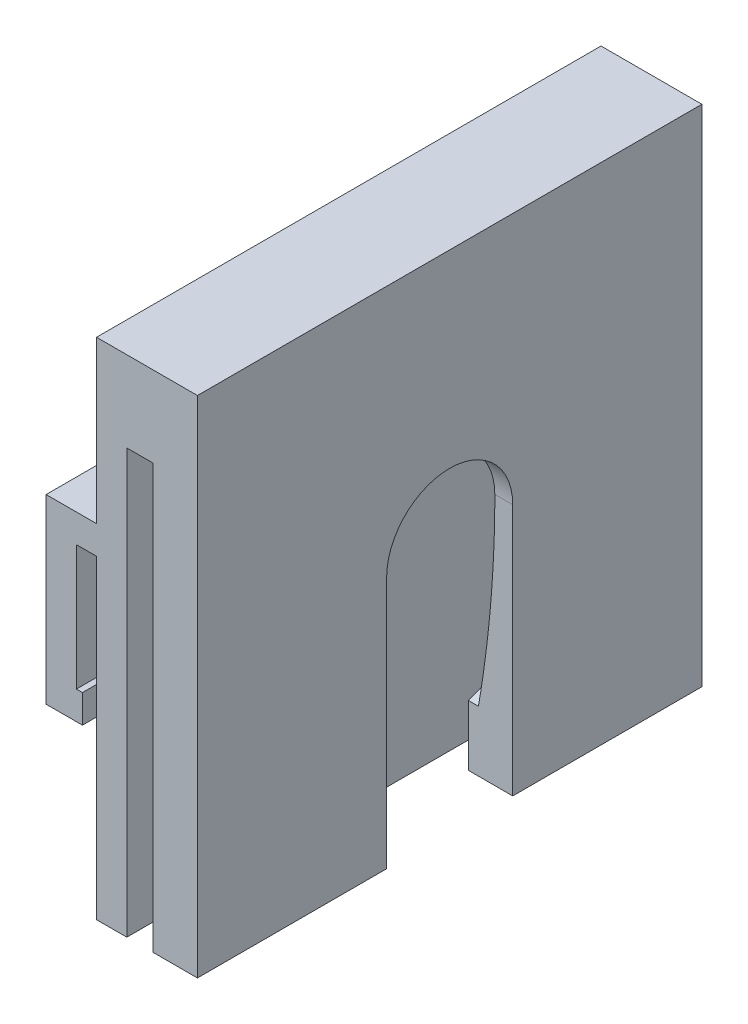
ISO-10303-21;
HEADER;
FILE_DESCRIPTION(('STEP AP214'),'2;1');
FILE_NAME('part.step','',(''),(''),'','','');
FILE_SCHEMA(('AUTOMOTIVE_DESIGN { 1 0 10303 214 1 1 1 1 }'));
ENDSEC;
DATA;
#1=APPLICATION_CONTEXT('core data for automotive mechanical design processes');
#2=APPLICATION_PROTOCOL_DEFINITION('international standard','automotive_design',2000,#1);
#3=PRODUCT_CONTEXT('',#1,'mechanical');
#4=PRODUCT('Part','Part','',(#3));
#5=PRODUCT_RELATED_PRODUCT_CATEGORY('part','',(#4));
#6=PRODUCT_DEFINITION_FORMATION('','',#4);
#7=PRODUCT_DEFINITION_CONTEXT('part definition',#1,'design');
#8=PRODUCT_DEFINITION('design','',#6,#7);
#9=PRODUCT_DEFINITION_SHAPE('','',#8);
#10=(LENGTH_UNIT() NAMED_UNIT(*) SI_UNIT(.MILLI.,.METRE.));
#11=(NAMED_UNIT(*) PLANE_ANGLE_UNIT() SI_UNIT($,.RADIAN.));
#12=(NAMED_UNIT(*) SI_UNIT($,.STERADIAN.) SOLID_ANGLE_UNIT());
#13=UNCERTAINTY_MEASURE_WITH_UNIT(LENGTH_MEASURE(1.E-05),#10,'distance_accuracy_value','');
#14=(GEOMETRIC_REPRESENTATION_CONTEXT(3) GLOBAL_UNCERTAINTY_ASSIGNED_CONTEXT((#13)) GLOBAL_UNIT_ASSIGNED_CONTEXT((#10,
#11,#12)) REPRESENTATION_CONTEXT('',''));
#15=CARTESIAN_POINT('',(0.,0.,0.));
#16=DIRECTION('',(0.,0.,1.));
#17=DIRECTION('',(1.,0.,0.));
#18=AXIS2_PLACEMENT_3D('',#15,#16,#17);
#19=CARTESIAN_POINT('',(-34.8553390593274,-12.5,25.));
#20=DIRECTION('',(0.,-1.,0.));
#21=DIRECTION('',(0.,0.,-1.));
#22=AXIS2_PLACEMENT_3D('',#19,#20,#21);
#23=PLANE('',#22);
#24=DIRECTION('',(1.,0.,0.));
#25=VECTOR('',#24,1.);
#26=CARTESIAN_POINT('',(-15.9642353760524,-12.5,9.375));
#27=LINE('',#26,#25);
#28=CARTESIAN_POINT('',(3.3,-12.5,9.375));
#29=VERTEX_POINT('',#28);
#30=CARTESIAN_POINT('',(5.5,-12.5,9.375));
#31=VERTEX_POINT('',#30);
#32=EDGE_CURVE('E274',#29,#31,#27,.T.);
#33=ORIENTED_EDGE('',*,*,#32,.F.);
#34=DIRECTION('',(0.,0.,1.));
#35=VECTOR('',#34,1.);
#36=CARTESIAN_POINT('',(3.3,-12.5,0.));
#37=LINE('',#36,#35);
#38=CARTESIAN_POINT('',(3.3,-12.5,0.));
#39=VERTEX_POINT('',#38);
#40=EDGE_CURVE('E236',#39,#29,#37,.T.);
#41=ORIENTED_EDGE('',*,*,#40,.F.);
#42=DIRECTION('',(1.,0.,0.));
#43=VECTOR('',#42,1.);
#44=CARTESIAN_POINT('',(-34.8553390593274,-12.5,0.));
#45=LINE('',#44,#43);
#46=CARTESIAN_POINT('',(5.5,-12.5,0.));
#47=VERTEX_POINT('',#46);
#48=EDGE_CURVE('E333',#39,#47,#45,.T.);
#49=ORIENTED_EDGE('',*,*,#48,.T.);
#50=DIRECTION('',(0.,0.,-1.));
#51=VECTOR('',#50,1.);
#52=CARTESIAN_POINT('',(5.5,-12.5,25.));
#53=LINE('',#52,#51);
#54=EDGE_CURVE('E304',#31,#47,#53,.T.);
#55=ORIENTED_EDGE('',*,*,#54,.F.);
#56=EDGE_LOOP('',(#33,#41,#49,#55));
#57=FACE_BOUND('',#56,.T.);
#58=ADVANCED_FACE('F33',(#57),#23,.T.);
#59=DIRECTION('',(0.,0.,-1.));
#60=VECTOR('',#59,1.);
#61=CARTESIAN_POINT('',(1.99999999999999,-12.5,25.));
#62=LINE('',#61,#60);
#63=CARTESIAN_POINT('',(1.99999999999999,-12.5,25.));
#64=VERTEX_POINT('',#63);
#65=CARTESIAN_POINT('',(2.,-12.5,0.));
#66=VERTEX_POINT('',#65);
#67=EDGE_CURVE('E273',#64,#66,#62,.T.);
#68=ORIENTED_EDGE('',*,*,#67,.F.);
#69=DIRECTION('',(1.,0.,0.));
#70=VECTOR('',#69,1.);
#71=CARTESIAN_POINT('',(-34.8553390593274,-12.5,25.));
#72=LINE('',#71,#70);
#73=CARTESIAN_POINT('',(0.5,-12.5,25.));
#74=VERTEX_POINT('',#73);
#75=EDGE_CURVE('E334',#74,#64,#72,.T.);
#76=ORIENTED_EDGE('',*,*,#75,.F.);
#77=DIRECTION('',(0.,0.,1.));
#78=VECTOR('',#77,1.);
#79=CARTESIAN_POINT('',(0.5,-12.5,25.));
#80=LINE('',#79,#78);
#81=CARTESIAN_POINT('',(0.5,-12.5,0.));
#82=VERTEX_POINT('',#81);
#83=EDGE_CURVE('E326',#82,#74,#80,.T.);
#84=ORIENTED_EDGE('',*,*,#83,.F.);
#85=EDGE_CURVE('E330',#82,#66,#45,.T.);
#86=ORIENTED_EDGE('',*,*,#85,.T.);
#87=EDGE_LOOP('',(#68,#76,#84,#86));
#88=FACE_BOUND('',#87,.T.);
#89=ADVANCED_FACE('F443',(#88),#23,.T.);
#90=CARTESIAN_POINT('',(2.,-4.5,25.));
#91=DIRECTION('',(0.,1.,0.));
#92=DIRECTION('',(-1.,0.,0.));
#93=AXIS2_PLACEMENT_3D('',#90,#91,#92);
#94=PLANE('',#93);
#95=DIRECTION('',(1.,0.,0.));
#96=VECTOR('',#95,1.);
#97=CARTESIAN_POINT('',(2.,-4.5,0.));
#98=LINE('',#97,#96);
#99=CARTESIAN_POINT('',(-2.,-4.5,0.));
#100=VERTEX_POINT('',#99);
#101=CARTESIAN_POINT('',(-0.200000000000001,-4.5,0.));
#102=VERTEX_POINT('',#101);
#103=EDGE_CURVE('E358',#100,#102,#98,.T.);
#104=ORIENTED_EDGE('',*,*,#103,.T.);
#105=DIRECTION('',(0.,0.,-1.));
#106=VECTOR('',#105,1.);
#107=CARTESIAN_POINT('',(-0.200000000000001,-4.5,25.));
#108=LINE('',#107,#106);
#109=CARTESIAN_POINT('',(-0.200000000000001,-4.5,25.));
#110=VERTEX_POINT('',#109);
#111=EDGE_CURVE('E229',#110,#102,#108,.T.);
#112=ORIENTED_EDGE('',*,*,#111,.F.);
#113=DIRECTION('',(1.,0.,0.));
#114=VECTOR('',#113,1.);
#115=CARTESIAN_POINT('',(2.,-4.5,25.));
#116=LINE('',#115,#114);
#117=CARTESIAN_POINT('',(-2.,-4.5,25.));
#118=VERTEX_POINT('',#117);
#119=EDGE_CURVE('E350',#118,#110,#116,.T.);
#120=ORIENTED_EDGE('',*,*,#119,.F.);
#121=DIRECTION('',(0.,0.,-1.));
#122=VECTOR('',#121,1.);
#123=CARTESIAN_POINT('',(-2.,-4.5,25.));
#124=LINE('',#123,#122);
#125=EDGE_CURVE('E364',#118,#100,#124,.T.);
#126=ORIENTED_EDGE('',*,*,#125,.T.);
#127=EDGE_LOOP('',(#104,#112,#120,#126));
#128=FACE_BOUND('',#127,.T.);
#129=ADVANCED_FACE('F448',(#128),#94,.F.);
#130=CARTESIAN_POINT('',(2.,4.5,25.));
#131=DIRECTION('',(0.,-1.,0.));
#132=DIRECTION('',(1.,0.,0.));
#133=AXIS2_PLACEMENT_3D('',#130,#131,#132);
#134=PLANE('',#133);
#135=DIRECTION('',(0.,0.,1.));
#136=VECTOR('',#135,1.);
#137=CARTESIAN_POINT('',(0.500000000000001,4.5,25.));
#138=LINE('',#137,#136);
#139=CARTESIAN_POINT('',(0.5,4.5,0.));
#140=VERTEX_POINT('',#139);
#141=CARTESIAN_POINT('',(0.499999999999999,4.5,25.));
#142=VERTEX_POINT('',#141);
#143=EDGE_CURVE('E339',#140,#142,#138,.T.);
#144=ORIENTED_EDGE('',*,*,#143,.F.);
#145=DIRECTION('',(-1.,0.,0.));
#146=VECTOR('',#145,1.);
#147=CARTESIAN_POINT('',(2.,4.5,0.));
#148=LINE('',#147,#146);
#149=CARTESIAN_POINT('',(-2.,4.5,0.));
#150=VERTEX_POINT('',#149);
#151=EDGE_CURVE('E351',#140,#150,#148,.T.);
#152=ORIENTED_EDGE('',*,*,#151,.T.);
#153=DIRECTION('',(0.,0.,-1.));
#154=VECTOR('',#153,1.);
#155=CARTESIAN_POINT('',(-2.,4.5,25.));
#156=LINE('',#155,#154);
#157=CARTESIAN_POINT('',(-2.,4.5,25.));
#158=VERTEX_POINT('',#157);
#159=EDGE_CURVE('E355',#158,#150,#156,.T.);
#160=ORIENTED_EDGE('',*,*,#159,.F.);
#161=DIRECTION('',(-1.,0.,0.));
#162=VECTOR('',#161,1.);
#163=CARTESIAN_POINT('',(2.,4.5,25.));
#164=LINE('',#163,#162);
#165=EDGE_CURVE('E353',#142,#158,#164,.T.);
#166=ORIENTED_EDGE('',*,*,#165,.F.);
#167=EDGE_LOOP('',(#144,#152,#160,#166));
#168=FACE_BOUND('',#167,.T.);
#169=ADVANCED_FACE('F494',(#168),#134,.F.);
#170=CARTESIAN_POINT('',(-2.,4.5,25.));
#171=DIRECTION('',(1.,0.,0.));
#172=DIRECTION('',(0.,1.,0.));
#173=AXIS2_PLACEMENT_3D('',#170,#171,#172);
#174=PLANE('',#173);
#175=DIRECTION('',(0.,-1.,0.));
#176=VECTOR('',#175,1.);
#177=CARTESIAN_POINT('',(-2.,4.5,0.));
#178=LINE('',#177,#176);
#179=EDGE_CURVE('E203',#150,#100,#178,.T.);
#180=ORIENTED_EDGE('',*,*,#179,.T.);
#181=ORIENTED_EDGE('',*,*,#125,.F.);
#182=DIRECTION('',(0.,-1.,0.));
#183=VECTOR('',#182,1.);
#184=CARTESIAN_POINT('',(-2.,4.5,25.));
#185=LINE('',#184,#183);
#186=EDGE_CURVE('E347',#158,#118,#185,.T.);
#187=ORIENTED_EDGE('',*,*,#186,.F.);
#188=ORIENTED_EDGE('',*,*,#159,.T.);
#189=EDGE_LOOP('',(#180,#181,#187,#188));
#190=FACE_BOUND('',#189,.T.);
#191=ADVANCED_FACE('F35',(#190),#174,.F.);
#192=CARTESIAN_POINT('',(0.,0.,25.));
#193=DIRECTION('',(0.,0.,-1.));
#194=DIRECTION('',(-1.,0.,0.));
#195=AXIS2_PLACEMENT_3D('',#192,#193,#194);
#196=PLANE('',#195);
#197=DIRECTION('',(1.,0.,0.));
#198=VECTOR('',#197,1.);
#199=CARTESIAN_POINT('',(0.5,3.1,25.));
#200=LINE('',#199,#198);
#201=CARTESIAN_POINT('',(-0.500000000000001,3.1,25.));
#202=VERTEX_POINT('',#201);
#203=CARTESIAN_POINT('',(0.5,3.1,25.));
#204=VERTEX_POINT('',#203);
#205=EDGE_CURVE('E210',#202,#204,#200,.T.);
#206=ORIENTED_EDGE('',*,*,#205,.T.);
#207=DIRECTION('',(0.,-1.,0.));
#208=VECTOR('',#207,1.);
#209=CARTESIAN_POINT('',(0.5,3.,25.));
#210=LINE('',#209,#208);
#211=EDGE_CURVE('E204',#204,#74,#210,.T.);
#212=ORIENTED_EDGE('',*,*,#211,.T.);
#213=ORIENTED_EDGE('',*,*,#75,.T.);
#214=DIRECTION('',(0.,-1.,0.));
#215=VECTOR('',#214,1.);
#216=CARTESIAN_POINT('',(1.99999999999999,8.5,25.));
#217=LINE('',#216,#215);
#218=CARTESIAN_POINT('',(1.99999999999999,8.5,25.));
#219=VERTEX_POINT('',#218);
#220=EDGE_CURVE('E291',#219,#64,#217,.T.);
#221=ORIENTED_EDGE('',*,*,#220,.F.);
#222=DIRECTION('',(-1.,0.,0.));
#223=VECTOR('',#222,1.);
#224=CARTESIAN_POINT('',(1.99999999999999,8.5,25.));
#225=LINE('',#224,#223);
#226=CARTESIAN_POINT('',(3.3,8.5,25.));
#227=VERTEX_POINT('',#226);
#228=EDGE_CURVE('E287',#227,#219,#225,.T.);
#229=ORIENTED_EDGE('',*,*,#228,.F.);
#230=DIRECTION('',(0.,1.,0.));
#231=VECTOR('',#230,1.);
#232=CARTESIAN_POINT('',(3.3,-12.5,25.));
#233=LINE('',#232,#231);
#234=CARTESIAN_POINT('',(3.3,-12.5,25.));
#235=VERTEX_POINT('',#234);
#236=EDGE_CURVE('E256',#235,#227,#233,.T.);
#237=ORIENTED_EDGE('',*,*,#236,.F.);
#238=CARTESIAN_POINT('',(5.5,-12.5,25.));
#239=VERTEX_POINT('',#238);
#240=EDGE_CURVE('E317',#235,#239,#72,.T.);
#241=ORIENTED_EDGE('',*,*,#240,.T.);
#242=DIRECTION('',(0.,-1.,0.));
#243=VECTOR('',#242,1.);
#244=CARTESIAN_POINT('',(5.5,12.5,25.));
#245=LINE('',#244,#243);
#246=CARTESIAN_POINT('',(5.5,12.5,25.));
#247=VERTEX_POINT('',#246);
#248=EDGE_CURVE('E314',#247,#239,#245,.T.);
#249=ORIENTED_EDGE('',*,*,#248,.F.);
#250=DIRECTION('',(1.,0.,0.));
#251=VECTOR('',#250,1.);
#252=CARTESIAN_POINT('',(-34.8553390593274,12.5,25.));
#253=LINE('',#252,#251);
#254=CARTESIAN_POINT('',(0.5,12.5,25.));
#255=VERTEX_POINT('',#254);
#256=EDGE_CURVE('E322',#255,#247,#253,.T.);
#257=ORIENTED_EDGE('',*,*,#256,.F.);
#258=DIRECTION('',(0.,1.,0.));
#259=VECTOR('',#258,1.);
#260=CARTESIAN_POINT('',(0.5,12.5,25.));
#261=LINE('',#260,#259);
#262=EDGE_CURVE('E324',#142,#255,#261,.T.);
#263=ORIENTED_EDGE('',*,*,#262,.F.);
#264=ORIENTED_EDGE('',*,*,#165,.T.);
#265=ORIENTED_EDGE('',*,*,#186,.T.);
#266=ORIENTED_EDGE('',*,*,#119,.T.);
#267=DIRECTION('',(0.,1.,0.));
#268=VECTOR('',#267,1.);
#269=CARTESIAN_POINT('',(-0.200000000000001,-4.5,25.));
#270=LINE('',#269,#268);
#271=CARTESIAN_POINT('',(-0.200000000000001,-3.1,25.));
#272=VERTEX_POINT('',#271);
#273=EDGE_CURVE('E215',#110,#272,#270,.T.);
#274=ORIENTED_EDGE('',*,*,#273,.T.);
#275=DIRECTION('',(-1.,0.,0.));
#276=VECTOR('',#275,1.);
#277=CARTESIAN_POINT('',(0.5,-3.1,25.));
#278=LINE('',#277,#276);
#279=CARTESIAN_POINT('',(-0.500000000000001,-3.1,25.));
#280=VERTEX_POINT('',#279);
#281=EDGE_CURVE('E48',#272,#280,#278,.T.);
#282=ORIENTED_EDGE('',*,*,#281,.T.);
#283=DIRECTION('',(0.,1.,0.));
#284=VECTOR('',#283,1.);
#285=CARTESIAN_POINT('',(-0.5,3.,25.));
#286=LINE('',#285,#284);
#287=EDGE_CURVE('E195',#280,#202,#286,.T.);
#288=ORIENTED_EDGE('',*,*,#287,.T.);
#289=EDGE_LOOP('',(#206,#212,#213,#221,#229,#237,#241,#249,#257,#263,#264,#265,#266,#274,#282,#288));
#290=FACE_BOUND('',#289,.T.);
#291=ADVANCED_FACE('F213',(#290),#196,.F.);
#292=CARTESIAN_POINT('',(0.,0.,0.));
#293=DIRECTION('',(0.,0.,-1.));
#294=DIRECTION('',(-1.,0.,0.));
#295=AXIS2_PLACEMENT_3D('',#292,#293,#294);
#296=PLANE('',#295);
#297=DIRECTION('',(0.,-1.,0.));
#298=VECTOR('',#297,1.);
#299=CARTESIAN_POINT('',(0.5,3.,0.));
#300=LINE('',#299,#298);
#301=CARTESIAN_POINT('',(0.5,3.1,0.));
#302=VERTEX_POINT('',#301);
#303=EDGE_CURVE('E342',#302,#82,#300,.T.);
#304=ORIENTED_EDGE('',*,*,#303,.F.);
#305=DIRECTION('',(1.,0.,0.));
#306=VECTOR('',#305,1.);
#307=CARTESIAN_POINT('',(0.5,3.1,0.));
#308=LINE('',#307,#306);
#309=CARTESIAN_POINT('',(-0.500000000000001,3.1,0.));
#310=VERTEX_POINT('',#309);
#311=EDGE_CURVE('E216',#310,#302,#308,.T.);
#312=ORIENTED_EDGE('',*,*,#311,.F.);
#313=DIRECTION('',(0.,1.,0.));
#314=VECTOR('',#313,1.);
#315=CARTESIAN_POINT('',(-0.5,3.,0.));
#316=LINE('',#315,#314);
#317=CARTESIAN_POINT('',(-0.500000000000001,-3.1,0.));
#318=VERTEX_POINT('',#317);
#319=EDGE_CURVE('E343',#318,#310,#316,.T.);
#320=ORIENTED_EDGE('',*,*,#319,.F.);
#321=DIRECTION('',(-1.,0.,0.));
#322=VECTOR('',#321,1.);
#323=CARTESIAN_POINT('',(0.5,-3.1,0.));
#324=LINE('',#323,#322);
#325=CARTESIAN_POINT('',(-0.200000000000001,-3.1,0.));
#326=VERTEX_POINT('',#325);
#327=EDGE_CURVE('E209',#326,#318,#324,.T.);
#328=ORIENTED_EDGE('',*,*,#327,.F.);
#329=DIRECTION('',(0.,1.,0.));
#330=VECTOR('',#329,1.);
#331=CARTESIAN_POINT('',(-0.200000000000001,-4.5,0.));
#332=LINE('',#331,#330);
#333=EDGE_CURVE('E226',#102,#326,#332,.T.);
#334=ORIENTED_EDGE('',*,*,#333,.F.);
#335=ORIENTED_EDGE('',*,*,#103,.F.);
#336=ORIENTED_EDGE('',*,*,#179,.F.);
#337=ORIENTED_EDGE('',*,*,#151,.F.);
#338=DIRECTION('',(0.,-1.,0.));
#339=VECTOR('',#338,1.);
#340=CARTESIAN_POINT('',(0.5,12.5,0.));
#341=LINE('',#340,#339);
#342=CARTESIAN_POINT('',(0.5,12.5,0.));
#343=VERTEX_POINT('',#342);
#344=EDGE_CURVE('E318',#343,#140,#341,.T.);
#345=ORIENTED_EDGE('',*,*,#344,.F.);
#346=DIRECTION('',(1.,0.,0.));
#347=VECTOR('',#346,1.);
#348=CARTESIAN_POINT('',(-34.8553390593274,12.5,0.));
#349=LINE('',#348,#347);
#350=CARTESIAN_POINT('',(5.5,12.5,0.));
#351=VERTEX_POINT('',#350);
#352=EDGE_CURVE('E328',#343,#351,#349,.T.);
#353=ORIENTED_EDGE('',*,*,#352,.T.);
#354=DIRECTION('',(0.,1.,0.));
#355=VECTOR('',#354,1.);
#356=CARTESIAN_POINT('',(5.5,-12.5,0.));
#357=LINE('',#356,#355);
#358=EDGE_CURVE('E308',#47,#351,#357,.T.);
#359=ORIENTED_EDGE('',*,*,#358,.F.);
#360=ORIENTED_EDGE('',*,*,#48,.F.);
#361=DIRECTION('',(0.,-1.,0.));
#362=VECTOR('',#361,1.);
#363=CARTESIAN_POINT('',(3.3,8.5,0.));
#364=LINE('',#363,#362);
#365=CARTESIAN_POINT('',(3.3,8.5,0.));
#366=VERTEX_POINT('',#365);
#367=EDGE_CURVE('E233',#366,#39,#364,.T.);
#368=ORIENTED_EDGE('',*,*,#367,.F.);
#369=DIRECTION('',(1.,0.,0.));
#370=VECTOR('',#369,1.);
#371=CARTESIAN_POINT('',(2.,8.5,0.));
#372=LINE('',#371,#370);
#373=CARTESIAN_POINT('',(2.,8.5,0.));
#374=VERTEX_POINT('',#373);
#375=EDGE_CURVE('E283',#374,#366,#372,.T.);
#376=ORIENTED_EDGE('',*,*,#375,.F.);
#377=DIRECTION('',(0.,-1.,0.));
#378=VECTOR('',#377,1.);
#379=CARTESIAN_POINT('',(2.,8.5,0.));
#380=LINE('',#379,#378);
#381=EDGE_CURVE('E289',#374,#66,#380,.T.);
#382=ORIENTED_EDGE('',*,*,#381,.T.);
#383=ORIENTED_EDGE('',*,*,#85,.F.);
#384=EDGE_LOOP('',(#304,#312,#320,#328,#334,#335,#336,#337,#345,#353,#359,#360,#368,#376,#382,#383));
#385=FACE_BOUND('',#384,.T.);
#386=ADVANCED_FACE('F394',(#385),#296,.T.);
#387=CARTESIAN_POINT('',(0.5,3.,25.));
#388=DIRECTION('',(1.,0.,0.));
#389=DIRECTION('',(0.,1.,0.));
#390=AXIS2_PLACEMENT_3D('',#387,#388,#389);
#391=PLANE('',#390);
#392=ORIENTED_EDGE('',*,*,#83,.T.);
#393=ORIENTED_EDGE('',*,*,#211,.F.);
#394=DIRECTION('',(0.,0.,-1.));
#395=VECTOR('',#394,1.);
#396=CARTESIAN_POINT('',(0.5,3.1,25.));
#397=LINE('',#396,#395);
#398=EDGE_CURVE('E223',#204,#302,#397,.T.);
#399=ORIENTED_EDGE('',*,*,#398,.T.);
#400=ORIENTED_EDGE('',*,*,#303,.T.);
#401=EDGE_LOOP('',(#392,#393,#399,#400));
#402=FACE_BOUND('',#401,.T.);
#403=ADVANCED_FACE('F461',(#402),#391,.F.);
#404=CARTESIAN_POINT('',(-0.5,3.,25.));
#405=DIRECTION('',(-1.,0.,0.));
#406=DIRECTION('',(0.,-1.,0.));
#407=AXIS2_PLACEMENT_3D('',#404,#405,#406);
#408=PLANE('',#407);
#409=ORIENTED_EDGE('',*,*,#319,.T.);
#410=DIRECTION('',(0.,0.,-1.));
#411=VECTOR('',#410,1.);
#412=CARTESIAN_POINT('',(-0.500000000000001,3.1,25.));
#413=LINE('',#412,#411);
#414=EDGE_CURVE('E199',#202,#310,#413,.T.);
#415=ORIENTED_EDGE('',*,*,#414,.F.);
#416=ORIENTED_EDGE('',*,*,#287,.F.);
#417=DIRECTION('',(0.,0.,-1.));
#418=VECTOR('',#417,1.);
#419=CARTESIAN_POINT('',(-0.500000000000001,-3.1,25.));
#420=LINE('',#419,#418);
#421=EDGE_CURVE('E197',#280,#318,#420,.T.);
#422=ORIENTED_EDGE('',*,*,#421,.T.);
#423=EDGE_LOOP('',(#409,#415,#416,#422));
#424=FACE_BOUND('',#423,.T.);
#425=ADVANCED_FACE('F196',(#424),#408,.F.);
#426=CARTESIAN_POINT('',(-34.8553390593274,12.5,25.));
#427=DIRECTION('',(0.,1.,0.));
#428=DIRECTION('',(0.,0.,1.));
#429=AXIS2_PLACEMENT_3D('',#426,#427,#428);
#430=PLANE('',#429);
#431=DIRECTION('',(0.,0.,-1.));
#432=VECTOR('',#431,1.);
#433=CARTESIAN_POINT('',(0.5,12.5,25.));
#434=LINE('',#433,#432);
#435=EDGE_CURVE('E321',#255,#343,#434,.T.);
#436=ORIENTED_EDGE('',*,*,#435,.F.);
#437=ORIENTED_EDGE('',*,*,#256,.T.);
#438=DIRECTION('',(0.,0.,1.));
#439=VECTOR('',#438,1.);
#440=CARTESIAN_POINT('',(5.5,12.5,0.));
#441=LINE('',#440,#439);
#442=EDGE_CURVE('E311',#351,#247,#441,.T.);
#443=ORIENTED_EDGE('',*,*,#442,.F.);
#444=ORIENTED_EDGE('',*,*,#352,.F.);
#445=EDGE_LOOP('',(#436,#437,#443,#444));
#446=FACE_BOUND('',#445,.T.);
#447=ADVANCED_FACE('F412',(#446),#430,.T.);
#448=ORIENTED_EDGE('',*,*,#344,.T.);
#449=ORIENTED_EDGE('',*,*,#143,.T.);
#450=ORIENTED_EDGE('',*,*,#262,.T.);
#451=ORIENTED_EDGE('',*,*,#435,.T.);
#452=EDGE_LOOP('',(#448,#449,#450,#451));
#453=FACE_BOUND('',#452,.T.);
#454=ADVANCED_FACE('F453',(#453),#391,.F.);
#455=DIRECTION('',(1.,0.,0.));
#456=VECTOR('',#455,1.);
#457=CARTESIAN_POINT('',(-15.9642353760524,-12.5,15.625));
#458=LINE('',#457,#456);
#459=CARTESIAN_POINT('',(3.3,-12.5,15.625));
#460=VERTEX_POINT('',#459);
#461=CARTESIAN_POINT('',(5.5,-12.5,15.625));
#462=VERTEX_POINT('',#461);
#463=EDGE_CURVE('E276',#460,#462,#458,.T.);
#464=ORIENTED_EDGE('',*,*,#463,.T.);
#465=EDGE_CURVE('E305',#239,#462,#53,.T.);
#466=ORIENTED_EDGE('',*,*,#465,.F.);
#467=ORIENTED_EDGE('',*,*,#240,.F.);
#468=DIRECTION('',(0.,0.,1.));
#469=VECTOR('',#468,1.);
#470=CARTESIAN_POINT('',(3.3,-12.5,15.625));
#471=LINE('',#470,#469);
#472=EDGE_CURVE('E253',#460,#235,#471,.T.);
#473=ORIENTED_EDGE('',*,*,#472,.F.);
#474=EDGE_LOOP('',(#464,#466,#467,#473));
#475=FACE_BOUND('',#474,.T.);
#476=ADVANCED_FACE('F418',(#475),#23,.T.);
#477=CARTESIAN_POINT('',(5.5,0.,0.));
#478=DIRECTION('',(1.,0.,0.));
#479=DIRECTION('',(0.,0.,-1.));
#480=AXIS2_PLACEMENT_3D('',#477,#478,#479);
#481=PLANE('',#480);
#482=DIRECTION('',(0.,1.,0.));
#483=VECTOR('',#482,1.);
#484=CARTESIAN_POINT('',(5.5,0.,9.375));
#485=LINE('',#484,#483);
#486=CARTESIAN_POINT('',(5.5,0.,9.375));
#487=VERTEX_POINT('',#486);
#488=EDGE_CURVE('E267',#31,#487,#485,.T.);
#489=ORIENTED_EDGE('',*,*,#488,.F.);
#490=ORIENTED_EDGE('',*,*,#54,.T.);
#491=ORIENTED_EDGE('',*,*,#358,.T.);
#492=ORIENTED_EDGE('',*,*,#442,.T.);
#493=ORIENTED_EDGE('',*,*,#248,.T.);
#494=ORIENTED_EDGE('',*,*,#465,.T.);
#495=DIRECTION('',(0.,-1.,0.));
#496=VECTOR('',#495,1.);
#497=CARTESIAN_POINT('',(5.5,0.,15.625));
#498=LINE('',#497,#496);
#499=CARTESIAN_POINT('',(5.5,0.,15.625));
#500=VERTEX_POINT('',#499);
#501=EDGE_CURVE('E265',#500,#462,#498,.T.);
#502=ORIENTED_EDGE('',*,*,#501,.F.);
#503=CARTESIAN_POINT('',(5.5,0.,12.5));
#504=DIRECTION('',(1.,0.,0.));
#505=DIRECTION('',(0.,0.,-1.));
#506=AXIS2_PLACEMENT_3D('',#503,#504,#505);
#507=CIRCLE('',#506,3.125);
#508=EDGE_CURVE('E262',#487,#500,#507,.T.);
#509=ORIENTED_EDGE('',*,*,#508,.F.);
#510=EDGE_LOOP('',(#489,#490,#491,#492,#493,#494,#502,#509));
#511=FACE_BOUND('',#510,.T.);
#512=ADVANCED_FACE('F404',(#511),#481,.T.);
#513=CARTESIAN_POINT('',(0.,8.5,0.));
#514=DIRECTION('',(0.,-1.,0.));
#515=DIRECTION('',(0.,0.,-1.));
#516=AXIS2_PLACEMENT_3D('',#513,#514,#515);
#517=PLANE('',#516);
#518=DIRECTION('',(0.,0.,-1.));
#519=VECTOR('',#518,1.);
#520=CARTESIAN_POINT('',(3.3,8.5,7.23217312357364));
#521=LINE('',#520,#519);
#522=CARTESIAN_POINT('',(3.3,8.50000000000002,7.23217312357363));
#523=VERTEX_POINT('',#522);
#524=EDGE_CURVE('E243',#523,#366,#521,.T.);
#525=ORIENTED_EDGE('',*,*,#524,.F.);
#526=DIRECTION('',(1.,0.,0.));
#527=VECTOR('',#526,1.);
#528=CARTESIAN_POINT('',(2.075,8.5,7.23217312357364));
#529=LINE('',#528,#527);
#530=CARTESIAN_POINT('',(2.,8.5,7.23217312357363));
#531=VERTEX_POINT('',#530);
#532=EDGE_CURVE('E297',#531,#523,#529,.T.);
#533=ORIENTED_EDGE('',*,*,#532,.F.);
#534=DIRECTION('',(0.,0.,-1.));
#535=VECTOR('',#534,1.);
#536=CARTESIAN_POINT('',(1.99999999999999,8.5,25.));
#537=LINE('',#536,#535);
#538=EDGE_CURVE('E284',#531,#374,#537,.T.);
#539=ORIENTED_EDGE('',*,*,#538,.T.);
#540=ORIENTED_EDGE('',*,*,#375,.T.);
#541=EDGE_LOOP('',(#525,#533,#539,#540));
#542=FACE_BOUND('',#541,.T.);
#543=ADVANCED_FACE('F389',(#542),#517,.T.);
#544=DIRECTION('',(0.,0.,-1.));
#545=VECTOR('',#544,1.);
#546=CARTESIAN_POINT('',(3.3,8.5,25.));
#547=LINE('',#546,#545);
#548=CARTESIAN_POINT('',(3.3,8.5,17.7678268764264));
#549=VERTEX_POINT('',#548);
#550=EDGE_CURVE('E258',#227,#549,#547,.T.);
#551=ORIENTED_EDGE('',*,*,#550,.F.);
#552=ORIENTED_EDGE('',*,*,#228,.T.);
#553=CARTESIAN_POINT('',(1.99999999999999,8.5,17.7678268764264));
#554=VERTEX_POINT('',#553);
#555=EDGE_CURVE('E280',#219,#554,#537,.T.);
#556=ORIENTED_EDGE('',*,*,#555,.T.);
#557=DIRECTION('',(1.,0.,0.));
#558=VECTOR('',#557,1.);
#559=CARTESIAN_POINT('',(2.075,8.5,17.7678268764264));
#560=LINE('',#559,#558);
#561=EDGE_CURVE('E293',#549,#554,#560,.F.);
#562=ORIENTED_EDGE('',*,*,#561,.F.);
#563=EDGE_LOOP('',(#551,#552,#556,#562));
#564=FACE_BOUND('',#563,.T.);
#565=ADVANCED_FACE('F660',(#564),#517,.T.);
#566=CARTESIAN_POINT('',(2.075,0.,12.5));
#567=DIRECTION('',(1.,0.,0.));
#568=DIRECTION('',(0.,0.,-1.));
#569=AXIS2_PLACEMENT_3D('',#566,#567,#568);
#570=CYLINDRICAL_SURFACE('',#569,9.99999999999999);
#571=CARTESIAN_POINT('',(1.99999999999999,0.,12.5));
#572=DIRECTION('',(1.,0.,0.));
#573=DIRECTION('',(0.,0.,-1.));
#574=AXIS2_PLACEMENT_3D('',#571,#572,#573);
#575=CIRCLE('',#574,10.);
#576=EDGE_CURVE('E300',#531,#554,#575,.T.);
#577=ORIENTED_EDGE('',*,*,#576,.F.);
#578=ORIENTED_EDGE('',*,*,#532,.T.);
#579=CARTESIAN_POINT('',(3.3,0.,12.5));
#580=DIRECTION('',(1.,0.,0.));
#581=DIRECTION('',(0.,0.,1.));
#582=AXIS2_PLACEMENT_3D('',#579,#580,#581);
#583=CIRCLE('',#582,10.);
#584=CARTESIAN_POINT('',(3.3,-9.49917759598172,9.375));
#585=VERTEX_POINT('',#584);
#586=EDGE_CURVE('E241',#585,#523,#583,.T.);
#587=ORIENTED_EDGE('',*,*,#586,.F.);
#588=DIRECTION('',(1.,0.,0.));
#589=VECTOR('',#588,1.);
#590=CARTESIAN_POINT('',(3.3,-9.49917759598172,9.375));
#591=LINE('',#590,#589);
#592=CARTESIAN_POINT('',(3.8,-9.49917759598172,9.375));
#593=VERTEX_POINT('',#592);
#594=EDGE_CURVE('E245',#585,#593,#591,.T.);
#595=ORIENTED_EDGE('',*,*,#594,.T.);
#596=CARTESIAN_POINT('',(3.8,0.,12.5));
#597=DIRECTION('',(1.,0.,0.));
#598=DIRECTION('',(0.,0.,-1.));
#599=AXIS2_PLACEMENT_3D('',#596,#597,#598);
#600=CIRCLE('',#599,9.99999999999999);
#601=CARTESIAN_POINT('',(3.8,-9.49917759598166,15.625));
#602=VERTEX_POINT('',#601);
#603=EDGE_CURVE('E55',#593,#602,#600,.T.);
#604=ORIENTED_EDGE('',*,*,#603,.T.);
#605=DIRECTION('',(1.,0.,0.));
#606=VECTOR('',#605,1.);
#607=CARTESIAN_POINT('',(3.3,-9.49917759598168,15.625));
#608=LINE('',#607,#606);
#609=CARTESIAN_POINT('',(3.3,-9.49917759598168,15.625));
#610=VERTEX_POINT('',#609);
#611=EDGE_CURVE('E260',#610,#602,#608,.T.);
#612=ORIENTED_EDGE('',*,*,#611,.F.);
#613=CARTESIAN_POINT('',(3.3,0.,12.5));
#614=DIRECTION('',(1.,0.,0.));
#615=DIRECTION('',(0.,0.,1.));
#616=AXIS2_PLACEMENT_3D('',#613,#614,#615);
#617=CIRCLE('',#616,10.);
#618=EDGE_CURVE('E247',#549,#610,#617,.T.);
#619=ORIENTED_EDGE('',*,*,#618,.F.);
#620=ORIENTED_EDGE('',*,*,#561,.T.);
#621=EDGE_LOOP('',(#577,#578,#587,#595,#604,#612,#619,#620));
#622=FACE_BOUND('',#621,.T.);
#623=ADVANCED_FACE('F383',(#622),#570,.F.);
#624=CARTESIAN_POINT('',(-51.31,0.,12.5));
#625=DIRECTION('',(1.,0.,0.));
#626=DIRECTION('',(0.,1.,0.));
#627=AXIS2_PLACEMENT_3D('',#624,#625,#626);
#628=SPHERICAL_SURFACE('',#627,56.0099285841359);
#629=CARTESIAN_POINT('',(-51.31,0.,9.375));
#630=DIRECTION('',(0.,0.,-1.));
#631=DIRECTION('',(0.,1.,0.));
#632=AXIS2_PLACEMENT_3D('',#629,#630,#631);
#633=CIRCLE('',#632,55.9226830096697);
#634=CARTESIAN_POINT('',(4.61268300966969,0.,9.375));
#635=VERTEX_POINT('',#634);
#636=EDGE_CURVE('E41',#635,#593,#633,.T.);
#637=ORIENTED_EDGE('',*,*,#636,.F.);
#638=CARTESIAN_POINT('',(4.6126830096697,0.,12.5));
#639=DIRECTION('',(-1.,0.,0.));
#640=DIRECTION('',(0.,0.,1.));
#641=AXIS2_PLACEMENT_3D('',#638,#639,#640);
#642=CIRCLE('',#641,3.125);
#643=CARTESIAN_POINT('',(4.61268300966969,0.,15.625));
#644=VERTEX_POINT('',#643);
#645=EDGE_CURVE('E369',#644,#635,#642,.T.);
#646=ORIENTED_EDGE('',*,*,#645,.F.);
#647=CARTESIAN_POINT('',(-51.31,0.,15.625));
#648=DIRECTION('',(0.,0.,1.));
#649=DIRECTION('',(0.,-1.,0.));
#650=AXIS2_PLACEMENT_3D('',#647,#648,#649);
#651=CIRCLE('',#650,55.9226830096697);
#652=EDGE_CURVE('E367',#602,#644,#651,.T.);
#653=ORIENTED_EDGE('',*,*,#652,.F.);
#654=ORIENTED_EDGE('',*,*,#603,.F.);
#655=EDGE_LOOP('',(#637,#646,#653,#654));
#656=FACE_BOUND('',#655,.T.);
#657=ADVANCED_FACE('F380',(#656),#628,.F.);
#658=CARTESIAN_POINT('',(1.99999999999999,10.,12.5));
#659=DIRECTION('',(1.,0.,0.));
#660=DIRECTION('',(0.,0.,-1.));
#661=AXIS2_PLACEMENT_3D('',#658,#659,#660);
#662=PLANE('',#661);
#663=ORIENTED_EDGE('',*,*,#576,.T.);
#664=ORIENTED_EDGE('',*,*,#555,.F.);
#665=ORIENTED_EDGE('',*,*,#220,.T.);
#666=ORIENTED_EDGE('',*,*,#67,.T.);
#667=ORIENTED_EDGE('',*,*,#381,.F.);
#668=ORIENTED_EDGE('',*,*,#538,.F.);
#669=EDGE_LOOP('',(#663,#664,#665,#666,#667,#668));
#670=FACE_BOUND('',#669,.T.);
#671=ADVANCED_FACE('F431',(#670),#662,.T.);
#672=CARTESIAN_POINT('',(-15.9642353760524,0.,12.5));
#673=DIRECTION('',(1.,0.,0.));
#674=DIRECTION('',(0.,0.,-1.));
#675=AXIS2_PLACEMENT_3D('',#672,#673,#674);
#676=CYLINDRICAL_SURFACE('',#675,3.125);
#677=ORIENTED_EDGE('',*,*,#645,.T.);
#678=DIRECTION('',(1.,0.,0.));
#679=VECTOR('',#678,1.);
#680=CARTESIAN_POINT('',(-15.9642353760524,0.,9.375));
#681=LINE('',#680,#679);
#682=EDGE_CURVE('E271',#635,#487,#681,.T.);
#683=ORIENTED_EDGE('',*,*,#682,.T.);
#684=ORIENTED_EDGE('',*,*,#508,.T.);
#685=DIRECTION('',(1.,0.,0.));
#686=VECTOR('',#685,1.);
#687=CARTESIAN_POINT('',(-15.9642353760524,0.,15.625));
#688=LINE('',#687,#686);
#689=EDGE_CURVE('E270',#644,#500,#688,.T.);
#690=ORIENTED_EDGE('',*,*,#689,.F.);
#691=EDGE_LOOP('',(#677,#683,#684,#690));
#692=FACE_BOUND('',#691,.T.);
#693=ADVANCED_FACE('F429',(#692),#676,.F.);
#694=CARTESIAN_POINT('',(-15.9642353760524,0.,9.375));
#695=DIRECTION('',(0.,0.,-1.));
#696=DIRECTION('',(0.,1.,0.));
#697=AXIS2_PLACEMENT_3D('',#694,#695,#696);
#698=PLANE('',#697);
#699=ORIENTED_EDGE('',*,*,#636,.T.);
#700=ORIENTED_EDGE('',*,*,#594,.F.);
#701=DIRECTION('',(0.,1.,0.));
#702=VECTOR('',#701,1.);
#703=CARTESIAN_POINT('',(3.3,-12.5,9.375));
#704=LINE('',#703,#702);
#705=EDGE_CURVE('E239',#29,#585,#704,.T.);
#706=ORIENTED_EDGE('',*,*,#705,.F.);
#707=ORIENTED_EDGE('',*,*,#32,.T.);
#708=ORIENTED_EDGE('',*,*,#488,.T.);
#709=ORIENTED_EDGE('',*,*,#682,.F.);
#710=EDGE_LOOP('',(#699,#700,#706,#707,#708,#709));
#711=FACE_BOUND('',#710,.T.);
#712=ADVANCED_FACE('F375',(#711),#698,.F.);
#713=CARTESIAN_POINT('',(-15.9642353760524,0.,15.625));
#714=DIRECTION('',(0.,0.,1.));
#715=DIRECTION('',(0.,-1.,0.));
#716=AXIS2_PLACEMENT_3D('',#713,#714,#715);
#717=PLANE('',#716);
#718=ORIENTED_EDGE('',*,*,#652,.T.);
#719=ORIENTED_EDGE('',*,*,#689,.T.);
#720=ORIENTED_EDGE('',*,*,#501,.T.);
#721=ORIENTED_EDGE('',*,*,#463,.F.);
#722=DIRECTION('',(0.,-1.,0.));
#723=VECTOR('',#722,1.);
#724=CARTESIAN_POINT('',(3.3,-9.49917759598168,15.625));
#725=LINE('',#724,#723);
#726=EDGE_CURVE('E250',#610,#460,#725,.T.);
#727=ORIENTED_EDGE('',*,*,#726,.F.);
#728=ORIENTED_EDGE('',*,*,#611,.T.);
#729=EDGE_LOOP('',(#718,#719,#720,#721,#727,#728));
#730=FACE_BOUND('',#729,.T.);
#731=ADVANCED_FACE('F421',(#730),#717,.F.);
#732=CARTESIAN_POINT('',(3.3,0.,12.5));
#733=DIRECTION('',(-1.,0.,0.));
#734=DIRECTION('',(0.,0.,1.));
#735=AXIS2_PLACEMENT_3D('',#732,#733,#734);
#736=PLANE('',#735);
#737=ORIENTED_EDGE('',*,*,#618,.T.);
#738=ORIENTED_EDGE('',*,*,#726,.T.);
#739=ORIENTED_EDGE('',*,*,#472,.T.);
#740=ORIENTED_EDGE('',*,*,#236,.T.);
#741=ORIENTED_EDGE('',*,*,#550,.T.);
#742=EDGE_LOOP('',(#737,#738,#739,#740,#741));
#743=FACE_BOUND('',#742,.T.);
#744=ADVANCED_FACE('F423',(#743),#736,.T.);
#745=CARTESIAN_POINT('',(3.3,0.,12.5));
#746=DIRECTION('',(-1.,0.,0.));
#747=DIRECTION('',(0.,0.,1.));
#748=AXIS2_PLACEMENT_3D('',#745,#746,#747);
#749=PLANE('',#748);
#750=ORIENTED_EDGE('',*,*,#367,.T.);
#751=ORIENTED_EDGE('',*,*,#40,.T.);
#752=ORIENTED_EDGE('',*,*,#705,.T.);
#753=ORIENTED_EDGE('',*,*,#586,.T.);
#754=ORIENTED_EDGE('',*,*,#524,.T.);
#755=EDGE_LOOP('',(#750,#751,#752,#753,#754));
#756=FACE_BOUND('',#755,.T.);
#757=ADVANCED_FACE('F386',(#756),#749,.T.);
#758=CARTESIAN_POINT('',(-0.200000000000001,-4.5,25.));
#759=DIRECTION('',(-1.,0.,0.));
#760=DIRECTION('',(0.,0.,1.));
#761=AXIS2_PLACEMENT_3D('',#758,#759,#760);
#762=PLANE('',#761);
#763=ORIENTED_EDGE('',*,*,#333,.T.);
#764=DIRECTION('',(0.,0.,1.));
#765=VECTOR('',#764,1.);
#766=CARTESIAN_POINT('',(-0.200000000000001,-3.1,25.));
#767=LINE('',#766,#765);
#768=EDGE_CURVE('E11',#326,#272,#767,.T.);
#769=ORIENTED_EDGE('',*,*,#768,.T.);
#770=ORIENTED_EDGE('',*,*,#273,.F.);
#771=ORIENTED_EDGE('',*,*,#111,.T.);
#772=EDGE_LOOP('',(#763,#769,#770,#771));
#773=FACE_BOUND('',#772,.T.);
#774=ADVANCED_FACE('F484',(#773),#762,.F.);
#775=CARTESIAN_POINT('',(0.5,-3.1,25.));
#776=DIRECTION('',(0.,-1.,0.));
#777=DIRECTION('',(0.,0.,-1.));
#778=AXIS2_PLACEMENT_3D('',#775,#776,#777);
#779=PLANE('',#778);
#780=ORIENTED_EDGE('',*,*,#327,.T.);
#781=ORIENTED_EDGE('',*,*,#421,.F.);
#782=ORIENTED_EDGE('',*,*,#281,.F.);
#783=ORIENTED_EDGE('',*,*,#768,.F.);
#784=EDGE_LOOP('',(#780,#781,#782,#783));
#785=FACE_BOUND('',#784,.T.);
#786=ADVANCED_FACE('F207',(#785),#779,.F.);
#787=CARTESIAN_POINT('',(0.5,3.1,25.));
#788=DIRECTION('',(0.,1.,0.));
#789=DIRECTION('',(0.,0.,1.));
#790=AXIS2_PLACEMENT_3D('',#787,#788,#789);
#791=PLANE('',#790);
#792=ORIENTED_EDGE('',*,*,#311,.T.);
#793=ORIENTED_EDGE('',*,*,#398,.F.);
#794=ORIENTED_EDGE('',*,*,#205,.F.);
#795=ORIENTED_EDGE('',*,*,#414,.T.);
#796=EDGE_LOOP('',(#792,#793,#794,#795));
#797=FACE_BOUND('',#796,.T.);
#798=ADVANCED_FACE('F480',(#797),#791,.F.);
#799=CLOSED_SHELL('',(#58,#89,#129,#169,#191,#291,#386,#403,#425,#447,#454,#476,#512,#543,#565,
#623,#657,#671,#693,#712,#731,#744,#757,#774,#786,#798));
#800=MANIFOLD_SOLID_BREP('B2',#799);
#801=ADVANCED_BREP_SHAPE_REPRESENTATION('',(#18,#800),#14);
#802=SHAPE_DEFINITION_REPRESENTATION(#9,#801);
ENDSEC;
END-ISO-10303-21;
